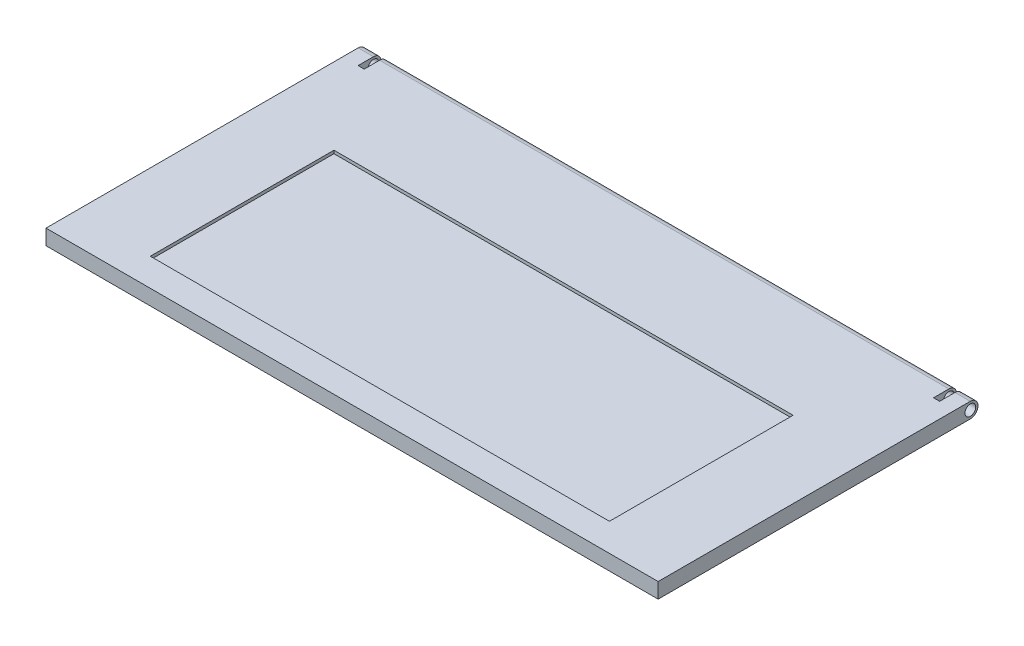
ISO-10303-21;
HEADER;
FILE_DESCRIPTION(('STEP AP214'),'2;1');
FILE_NAME('part.step','',(''),(''),'','','');
FILE_SCHEMA(('AUTOMOTIVE_DESIGN { 1 0 10303 214 1 1 1 1 }'));
ENDSEC;
DATA;
#1=APPLICATION_CONTEXT('core data for automotive mechanical design processes');
#2=APPLICATION_PROTOCOL_DEFINITION('international standard','automotive_design',2000,#1);
#3=PRODUCT_CONTEXT('',#1,'mechanical');
#4=PRODUCT('Part','Part','',(#3));
#5=PRODUCT_RELATED_PRODUCT_CATEGORY('part','',(#4));
#6=PRODUCT_DEFINITION_FORMATION('','',#4);
#7=PRODUCT_DEFINITION_CONTEXT('part definition',#1,'design');
#8=PRODUCT_DEFINITION('design','',#6,#7);
#9=PRODUCT_DEFINITION_SHAPE('','',#8);
#10=(LENGTH_UNIT() NAMED_UNIT(*) SI_UNIT(.MILLI.,.METRE.));
#11=(NAMED_UNIT(*) PLANE_ANGLE_UNIT() SI_UNIT($,.RADIAN.));
#12=(NAMED_UNIT(*) SI_UNIT($,.STERADIAN.) SOLID_ANGLE_UNIT());
#13=UNCERTAINTY_MEASURE_WITH_UNIT(LENGTH_MEASURE(1.E-05),#10,'distance_accuracy_value','');
#14=(GEOMETRIC_REPRESENTATION_CONTEXT(3) GLOBAL_UNCERTAINTY_ASSIGNED_CONTEXT((#13)) GLOBAL_UNIT_ASSIGNED_CONTEXT((#10,
#11,#12)) REPRESENTATION_CONTEXT('',''));
#15=CARTESIAN_POINT('',(0.,0.,0.));
#16=DIRECTION('',(0.,0.,1.));
#17=DIRECTION('',(1.,0.,0.));
#18=AXIS2_PLACEMENT_3D('',#15,#16,#17);
#19=CARTESIAN_POINT('',(-93.,5.,47.5));
#20=DIRECTION('',(1.,0.,0.));
#21=DIRECTION('',(0.,0.,-1.));
#22=AXIS2_PLACEMENT_3D('',#19,#20,#21);
#23=PLANE('',#22);
#24=CARTESIAN_POINT('',(-93.,2.5,-54.5));
#25=DIRECTION('',(-1.,0.,0.));
#26=DIRECTION('',(0.,0.,1.));
#27=AXIS2_PLACEMENT_3D('',#24,#25,#26);
#28=CIRCLE('',#27,1.75);
#29=CARTESIAN_POINT('',(-93.,2.5,-52.75));
#30=VERTEX_POINT('',#29);
#31=EDGE_CURVE('E262',#30,#30,#28,.T.);
#32=ORIENTED_EDGE('',*,*,#31,.F.);
#33=EDGE_LOOP('',(#32));
#34=FACE_BOUND('',#33,.T.);
#35=DIRECTION('',(0.,-1.,0.));
#36=VECTOR('',#35,1.);
#37=CARTESIAN_POINT('',(-93.,5.,-49.4697976722573));
#38=LINE('',#37,#36);
#39=CARTESIAN_POINT('',(-93.,5.,-49.4697976722573));
#40=VERTEX_POINT('',#39);
#41=CARTESIAN_POINT('',(-93.,0.,-49.4697976722573));
#42=VERTEX_POINT('',#41);
#43=EDGE_CURVE('E58',#40,#42,#38,.T.);
#44=ORIENTED_EDGE('',*,*,#43,.F.);
#45=DIRECTION('',(0.,0.,1.));
#46=VECTOR('',#45,1.);
#47=CARTESIAN_POINT('',(-93.,5.,47.5));
#48=LINE('',#47,#46);
#49=CARTESIAN_POINT('',(-93.,5.,-54.5));
#50=VERTEX_POINT('',#49);
#51=EDGE_CURVE('E252',#50,#40,#48,.T.);
#52=ORIENTED_EDGE('',*,*,#51,.F.);
#53=CARTESIAN_POINT('',(-93.,2.5,-54.5));
#54=DIRECTION('',(-1.,0.,0.));
#55=DIRECTION('',(0.,0.,-1.));
#56=AXIS2_PLACEMENT_3D('',#53,#54,#55);
#57=CIRCLE('',#56,2.5);
#58=CARTESIAN_POINT('',(-93.,0.,-54.5));
#59=VERTEX_POINT('',#58);
#60=EDGE_CURVE('E261',#50,#59,#57,.T.);
#61=ORIENTED_EDGE('',*,*,#60,.T.);
#62=DIRECTION('',(0.,0.,1.));
#63=VECTOR('',#62,1.);
#64=CARTESIAN_POINT('',(-93.,0.,47.5));
#65=LINE('',#64,#63);
#66=EDGE_CURVE('E302',#59,#42,#65,.T.);
#67=ORIENTED_EDGE('',*,*,#66,.T.);
#68=EDGE_LOOP('',(#44,#52,#61,#67));
#69=FACE_BOUND('',#68,.T.);
#70=ADVANCED_FACE('F33',(#34,#69),#23,.F.);
#71=CARTESIAN_POINT('',(93.,5.,47.5));
#72=DIRECTION('',(0.,0.,-1.));
#73=DIRECTION('',(-1.,0.,0.));
#74=AXIS2_PLACEMENT_3D('',#71,#72,#73);
#75=PLANE('',#74);
#76=DIRECTION('',(1.,0.,0.));
#77=VECTOR('',#76,1.);
#78=CARTESIAN_POINT('',(93.,0.,47.5));
#79=LINE('',#78,#77);
#80=CARTESIAN_POINT('',(-100.,0.,47.5));
#81=VERTEX_POINT('',#80);
#82=CARTESIAN_POINT('',(100.,0.,47.5));
#83=VERTEX_POINT('',#82);
#84=EDGE_CURVE('E314',#81,#83,#79,.T.);
#85=ORIENTED_EDGE('',*,*,#84,.T.);
#86=DIRECTION('',(0.,1.,0.));
#87=VECTOR('',#86,1.);
#88=CARTESIAN_POINT('',(100.,0.,47.5));
#89=LINE('',#88,#87);
#90=CARTESIAN_POINT('',(100.,5.,47.5));
#91=VERTEX_POINT('',#90);
#92=EDGE_CURVE('E175',#83,#91,#89,.T.);
#93=ORIENTED_EDGE('',*,*,#92,.T.);
#94=DIRECTION('',(1.,0.,0.));
#95=VECTOR('',#94,1.);
#96=CARTESIAN_POINT('',(93.,5.,47.5));
#97=LINE('',#96,#95);
#98=CARTESIAN_POINT('',(-100.,5.,47.5));
#99=VERTEX_POINT('',#98);
#100=EDGE_CURVE('E42',#99,#91,#97,.T.);
#101=ORIENTED_EDGE('',*,*,#100,.F.);
#102=DIRECTION('',(0.,1.,0.));
#103=VECTOR('',#102,1.);
#104=CARTESIAN_POINT('',(-100.,0.,47.5));
#105=LINE('',#104,#103);
#106=EDGE_CURVE('E204',#81,#99,#105,.T.);
#107=ORIENTED_EDGE('',*,*,#106,.F.);
#108=EDGE_LOOP('',(#85,#93,#101,#107));
#109=FACE_BOUND('',#108,.T.);
#110=ADVANCED_FACE('F346',(#109),#75,.F.);
#111=CARTESIAN_POINT('',(93.,5.,47.5));
#112=DIRECTION('',(-1.,0.,0.));
#113=DIRECTION('',(0.,0.,1.));
#114=AXIS2_PLACEMENT_3D('',#111,#112,#113);
#115=PLANE('',#114);
#116=DIRECTION('',(0.,0.,-1.));
#117=VECTOR('',#116,1.);
#118=CARTESIAN_POINT('',(93.,5.,47.5));
#119=LINE('',#118,#117);
#120=CARTESIAN_POINT('',(93.,5.,-49.4697976722574));
#121=VERTEX_POINT('',#120);
#122=CARTESIAN_POINT('',(93.,5.,-54.5));
#123=VERTEX_POINT('',#122);
#124=EDGE_CURVE('E11',#121,#123,#119,.T.);
#125=ORIENTED_EDGE('',*,*,#124,.F.);
#126=DIRECTION('',(0.,-1.,0.));
#127=VECTOR('',#126,1.);
#128=CARTESIAN_POINT('',(93.,5.,-49.4697976722574));
#129=LINE('',#128,#127);
#130=CARTESIAN_POINT('',(93.,0.,-49.4697976722574));
#131=VERTEX_POINT('',#130);
#132=EDGE_CURVE('E228',#121,#131,#129,.T.);
#133=ORIENTED_EDGE('',*,*,#132,.T.);
#134=DIRECTION('',(0.,0.,-1.));
#135=VECTOR('',#134,1.);
#136=CARTESIAN_POINT('',(93.,0.,47.5));
#137=LINE('',#136,#135);
#138=CARTESIAN_POINT('',(93.,0.,-54.5));
#139=VERTEX_POINT('',#138);
#140=EDGE_CURVE('E317',#131,#139,#137,.T.);
#141=ORIENTED_EDGE('',*,*,#140,.T.);
#142=CARTESIAN_POINT('',(93.,2.5,-54.5));
#143=DIRECTION('',(-1.,0.,0.));
#144=DIRECTION('',(0.,0.,-1.));
#145=AXIS2_PLACEMENT_3D('',#142,#143,#144);
#146=CIRCLE('',#145,2.5);
#147=EDGE_CURVE('E265',#123,#139,#146,.T.);
#148=ORIENTED_EDGE('',*,*,#147,.F.);
#149=EDGE_LOOP('',(#125,#133,#141,#148));
#150=FACE_BOUND('',#149,.T.);
#151=CARTESIAN_POINT('',(93.,2.5,-54.5));
#152=DIRECTION('',(-1.,0.,0.));
#153=DIRECTION('',(0.,0.,1.));
#154=AXIS2_PLACEMENT_3D('',#151,#152,#153);
#155=CIRCLE('',#154,1.75);
#156=CARTESIAN_POINT('',(93.,2.5,-52.75));
#157=VERTEX_POINT('',#156);
#158=EDGE_CURVE('E258',#157,#157,#155,.T.);
#159=ORIENTED_EDGE('',*,*,#158,.T.);
#160=EDGE_LOOP('',(#159));
#161=FACE_BOUND('',#160,.T.);
#162=ADVANCED_FACE('F355',(#150,#161),#115,.F.);
#163=CARTESIAN_POINT('',(0.,5.,0.));
#164=DIRECTION('',(0.,1.,0.));
#165=DIRECTION('',(0.,0.,1.));
#166=AXIS2_PLACEMENT_3D('',#163,#164,#165);
#167=PLANE('',#166);
#168=DIRECTION('',(0.,0.,1.));
#169=VECTOR('',#168,1.);
#170=CARTESIAN_POINT('',(-75.,5.,38.4183408832541));
#171=LINE('',#170,#169);
#172=CARTESIAN_POINT('',(-75.,5.,-21.5816591167459));
#173=VERTEX_POINT('',#172);
#174=CARTESIAN_POINT('',(-75.,5.,38.4183408832541));
#175=VERTEX_POINT('',#174);
#176=EDGE_CURVE('E274',#173,#175,#171,.T.);
#177=ORIENTED_EDGE('',*,*,#176,.F.);
#178=DIRECTION('',(-1.,0.,0.));
#179=VECTOR('',#178,1.);
#180=CARTESIAN_POINT('',(75.,5.,-21.5816591167459));
#181=LINE('',#180,#179);
#182=CARTESIAN_POINT('',(75.,5.,-21.5816591167459));
#183=VERTEX_POINT('',#182);
#184=EDGE_CURVE('E281',#183,#173,#181,.T.);
#185=ORIENTED_EDGE('',*,*,#184,.F.);
#186=DIRECTION('',(0.,0.,-1.));
#187=VECTOR('',#186,1.);
#188=CARTESIAN_POINT('',(75.,5.,38.4183408832541));
#189=LINE('',#188,#187);
#190=CARTESIAN_POINT('',(75.,5.,38.4183408832541));
#191=VERTEX_POINT('',#190);
#192=EDGE_CURVE('E295',#191,#183,#189,.T.);
#193=ORIENTED_EDGE('',*,*,#192,.F.);
#194=DIRECTION('',(1.,0.,0.));
#195=VECTOR('',#194,1.);
#196=CARTESIAN_POINT('',(75.,5.,38.4183408832541));
#197=LINE('',#196,#195);
#198=EDGE_CURVE('E292',#175,#191,#197,.T.);
#199=ORIENTED_EDGE('',*,*,#198,.F.);
#200=EDGE_LOOP('',(#177,#185,#193,#199));
#201=FACE_BOUND('',#200,.T.);
#202=ORIENTED_EDGE('',*,*,#51,.T.);
#203=DIRECTION('',(1.,0.,0.));
#204=VECTOR('',#203,1.);
#205=CARTESIAN_POINT('',(-95.,5.,-49.4697976722573));
#206=LINE('',#205,#204);
#207=CARTESIAN_POINT('',(-95.,5.,-49.4697976722573));
#208=VERTEX_POINT('',#207);
#209=EDGE_CURVE('E246',#208,#40,#206,.T.);
#210=ORIENTED_EDGE('',*,*,#209,.F.);
#211=DIRECTION('',(0.,0.,-1.));
#212=VECTOR('',#211,1.);
#213=CARTESIAN_POINT('',(-95.,5.,-54.5));
#214=LINE('',#213,#212);
#215=CARTESIAN_POINT('',(-95.,5.,-54.5));
#216=VERTEX_POINT('',#215);
#217=EDGE_CURVE('E201',#208,#216,#214,.T.);
#218=ORIENTED_EDGE('',*,*,#217,.T.);
#219=DIRECTION('',(1.,0.,0.));
#220=VECTOR('',#219,1.);
#221=CARTESIAN_POINT('',(-100.,5.,-54.5));
#222=LINE('',#221,#220);
#223=CARTESIAN_POINT('',(-100.,5.,-54.5));
#224=VERTEX_POINT('',#223);
#225=EDGE_CURVE('E209',#224,#216,#222,.T.);
#226=ORIENTED_EDGE('',*,*,#225,.F.);
#227=DIRECTION('',(0.,0.,-1.));
#228=VECTOR('',#227,1.);
#229=CARTESIAN_POINT('',(-100.,5.,-54.5));
#230=LINE('',#229,#228);
#231=EDGE_CURVE('E207',#99,#224,#230,.T.);
#232=ORIENTED_EDGE('',*,*,#231,.F.);
#233=ORIENTED_EDGE('',*,*,#100,.T.);
#234=DIRECTION('',(0.,0.,-1.));
#235=VECTOR('',#234,1.);
#236=CARTESIAN_POINT('',(100.,5.,-54.5));
#237=LINE('',#236,#235);
#238=CARTESIAN_POINT('',(100.,5.,-54.5));
#239=VERTEX_POINT('',#238);
#240=EDGE_CURVE('E167',#91,#239,#237,.T.);
#241=ORIENTED_EDGE('',*,*,#240,.T.);
#242=DIRECTION('',(-1.,0.,0.));
#243=VECTOR('',#242,1.);
#244=CARTESIAN_POINT('',(100.,5.,-54.5));
#245=LINE('',#244,#243);
#246=CARTESIAN_POINT('',(95.,5.,-54.5));
#247=VERTEX_POINT('',#246);
#248=EDGE_CURVE('E150',#239,#247,#245,.T.);
#249=ORIENTED_EDGE('',*,*,#248,.T.);
#250=DIRECTION('',(0.,0.,-1.));
#251=VECTOR('',#250,1.);
#252=CARTESIAN_POINT('',(95.,5.,-54.5));
#253=LINE('',#252,#251);
#254=CARTESIAN_POINT('',(95.,5.,-49.4697976722574));
#255=VERTEX_POINT('',#254);
#256=EDGE_CURVE('E182',#255,#247,#253,.T.);
#257=ORIENTED_EDGE('',*,*,#256,.F.);
#258=DIRECTION('',(-1.,0.,0.));
#259=VECTOR('',#258,1.);
#260=CARTESIAN_POINT('',(95.,5.,-49.4697976722574));
#261=LINE('',#260,#259);
#262=EDGE_CURVE('E234',#255,#121,#261,.T.);
#263=ORIENTED_EDGE('',*,*,#262,.T.);
#264=ORIENTED_EDGE('',*,*,#124,.T.);
#265=DIRECTION('',(-1.,0.,0.));
#266=VECTOR('',#265,1.);
#267=CARTESIAN_POINT('',(93.,5.,-54.5));
#268=LINE('',#267,#266);
#269=EDGE_CURVE('E268',#123,#50,#268,.T.);
#270=ORIENTED_EDGE('',*,*,#269,.T.);
#271=EDGE_LOOP('',(#202,#210,#218,#226,#232,#233,#241,#249,#257,#263,#264,#270));
#272=FACE_BOUND('',#271,.T.);
#273=ADVANCED_FACE('F173',(#201,#272),#167,.T.);
#274=CARTESIAN_POINT('',(0.,0.,0.));
#275=DIRECTION('',(0.,1.,0.));
#276=DIRECTION('',(0.,0.,1.));
#277=AXIS2_PLACEMENT_3D('',#274,#275,#276);
#278=PLANE('',#277);
#279=ORIENTED_EDGE('',*,*,#66,.F.);
#280=DIRECTION('',(-1.,0.,0.));
#281=VECTOR('',#280,1.);
#282=CARTESIAN_POINT('',(93.,0.,-54.5));
#283=LINE('',#282,#281);
#284=EDGE_CURVE('E271',#139,#59,#283,.T.);
#285=ORIENTED_EDGE('',*,*,#284,.F.);
#286=ORIENTED_EDGE('',*,*,#140,.F.);
#287=DIRECTION('',(-1.,0.,0.));
#288=VECTOR('',#287,1.);
#289=CARTESIAN_POINT('',(95.,0.,-49.4697976722574));
#290=LINE('',#289,#288);
#291=CARTESIAN_POINT('',(95.,0.,-49.4697976722574));
#292=VERTEX_POINT('',#291);
#293=EDGE_CURVE('E50',#292,#131,#290,.T.);
#294=ORIENTED_EDGE('',*,*,#293,.F.);
#295=DIRECTION('',(0.,0.,1.));
#296=VECTOR('',#295,1.);
#297=CARTESIAN_POINT('',(95.,0.,47.5));
#298=LINE('',#297,#296);
#299=CARTESIAN_POINT('',(95.,0.,-54.5));
#300=VERTEX_POINT('',#299);
#301=EDGE_CURVE('E171',#300,#292,#298,.T.);
#302=ORIENTED_EDGE('',*,*,#301,.F.);
#303=DIRECTION('',(-1.,0.,0.));
#304=VECTOR('',#303,1.);
#305=CARTESIAN_POINT('',(100.,0.,-54.5));
#306=LINE('',#305,#304);
#307=CARTESIAN_POINT('',(100.,0.,-54.5));
#308=VERTEX_POINT('',#307);
#309=EDGE_CURVE('E161',#308,#300,#306,.T.);
#310=ORIENTED_EDGE('',*,*,#309,.F.);
#311=DIRECTION('',(0.,0.,1.));
#312=VECTOR('',#311,1.);
#313=CARTESIAN_POINT('',(100.,0.,47.5));
#314=LINE('',#313,#312);
#315=EDGE_CURVE('E170',#308,#83,#314,.T.);
#316=ORIENTED_EDGE('',*,*,#315,.T.);
#317=ORIENTED_EDGE('',*,*,#84,.F.);
#318=DIRECTION('',(0.,0.,1.));
#319=VECTOR('',#318,1.);
#320=CARTESIAN_POINT('',(-100.,0.,47.5));
#321=LINE('',#320,#319);
#322=CARTESIAN_POINT('',(-100.,0.,-54.5));
#323=VERTEX_POINT('',#322);
#324=EDGE_CURVE('E200',#323,#81,#321,.T.);
#325=ORIENTED_EDGE('',*,*,#324,.F.);
#326=DIRECTION('',(1.,0.,0.));
#327=VECTOR('',#326,1.);
#328=CARTESIAN_POINT('',(-100.,0.,-54.5));
#329=LINE('',#328,#327);
#330=CARTESIAN_POINT('',(-95.,0.,-54.5));
#331=VERTEX_POINT('',#330);
#332=EDGE_CURVE('E230',#323,#331,#329,.T.);
#333=ORIENTED_EDGE('',*,*,#332,.T.);
#334=DIRECTION('',(0.,0.,1.));
#335=VECTOR('',#334,1.);
#336=CARTESIAN_POINT('',(-95.,0.,47.5));
#337=LINE('',#336,#335);
#338=CARTESIAN_POINT('',(-95.,0.,-49.4697976722573));
#339=VERTEX_POINT('',#338);
#340=EDGE_CURVE('E212',#331,#339,#337,.T.);
#341=ORIENTED_EDGE('',*,*,#340,.T.);
#342=DIRECTION('',(1.,0.,0.));
#343=VECTOR('',#342,1.);
#344=CARTESIAN_POINT('',(-95.,0.,-49.4697976722573));
#345=LINE('',#344,#343);
#346=EDGE_CURVE('E241',#339,#42,#345,.T.);
#347=ORIENTED_EDGE('',*,*,#346,.T.);
#348=EDGE_LOOP('',(#279,#285,#286,#294,#302,#310,#316,#317,#325,#333,#341,#347));
#349=FACE_BOUND('',#348,.T.);
#350=ADVANCED_FACE('F333',(#349),#278,.F.);
#351=CARTESIAN_POINT('',(-75.,4.,38.4183408832541));
#352=DIRECTION('',(-1.,0.,0.));
#353=DIRECTION('',(0.,0.,1.));
#354=AXIS2_PLACEMENT_3D('',#351,#352,#353);
#355=PLANE('',#354);
#356=ORIENTED_EDGE('',*,*,#176,.T.);
#357=DIRECTION('',(0.,1.,0.));
#358=VECTOR('',#357,1.);
#359=CARTESIAN_POINT('',(-75.,4.,38.4183408832541));
#360=LINE('',#359,#358);
#361=CARTESIAN_POINT('',(-75.,4.,38.4183408832541));
#362=VERTEX_POINT('',#361);
#363=EDGE_CURVE('E290',#362,#175,#360,.T.);
#364=ORIENTED_EDGE('',*,*,#363,.F.);
#365=DIRECTION('',(0.,0.,1.));
#366=VECTOR('',#365,1.);
#367=CARTESIAN_POINT('',(-75.,4.,38.4183408832541));
#368=LINE('',#367,#366);
#369=CARTESIAN_POINT('',(-75.,4.,-21.5816591167459));
#370=VERTEX_POINT('',#369);
#371=EDGE_CURVE('E277',#370,#362,#368,.T.);
#372=ORIENTED_EDGE('',*,*,#371,.F.);
#373=DIRECTION('',(0.,1.,0.));
#374=VECTOR('',#373,1.);
#375=CARTESIAN_POINT('',(-75.,4.,-21.5816591167459));
#376=LINE('',#375,#374);
#377=EDGE_CURVE('E300',#370,#173,#376,.T.);
#378=ORIENTED_EDGE('',*,*,#377,.T.);
#379=EDGE_LOOP('',(#356,#364,#372,#378));
#380=FACE_BOUND('',#379,.T.);
#381=ADVANCED_FACE('F376',(#380),#355,.F.);
#382=CARTESIAN_POINT('',(75.,4.,-21.5816591167459));
#383=DIRECTION('',(0.,0.,-1.));
#384=DIRECTION('',(-1.,0.,0.));
#385=AXIS2_PLACEMENT_3D('',#382,#383,#384);
#386=PLANE('',#385);
#387=ORIENTED_EDGE('',*,*,#184,.T.);
#388=ORIENTED_EDGE('',*,*,#377,.F.);
#389=DIRECTION('',(-1.,0.,0.));
#390=VECTOR('',#389,1.);
#391=CARTESIAN_POINT('',(75.,4.,-21.5816591167459));
#392=LINE('',#391,#390);
#393=CARTESIAN_POINT('',(75.,4.,-21.5816591167459));
#394=VERTEX_POINT('',#393);
#395=EDGE_CURVE('E287',#394,#370,#392,.T.);
#396=ORIENTED_EDGE('',*,*,#395,.F.);
#397=DIRECTION('',(0.,1.,0.));
#398=VECTOR('',#397,1.);
#399=CARTESIAN_POINT('',(75.,4.,-21.5816591167459));
#400=LINE('',#399,#398);
#401=EDGE_CURVE('E303',#394,#183,#400,.T.);
#402=ORIENTED_EDGE('',*,*,#401,.T.);
#403=EDGE_LOOP('',(#387,#388,#396,#402));
#404=FACE_BOUND('',#403,.T.);
#405=ADVANCED_FACE('F382',(#404),#386,.F.);
#406=CARTESIAN_POINT('',(75.,4.,38.4183408832541));
#407=DIRECTION('',(1.,0.,0.));
#408=DIRECTION('',(0.,0.,-1.));
#409=AXIS2_PLACEMENT_3D('',#406,#407,#408);
#410=PLANE('',#409);
#411=ORIENTED_EDGE('',*,*,#192,.T.);
#412=ORIENTED_EDGE('',*,*,#401,.F.);
#413=DIRECTION('',(0.,0.,-1.));
#414=VECTOR('',#413,1.);
#415=CARTESIAN_POINT('',(75.,4.,38.4183408832541));
#416=LINE('',#415,#414);
#417=CARTESIAN_POINT('',(75.,4.,38.4183408832541));
#418=VERTEX_POINT('',#417);
#419=EDGE_CURVE('E284',#418,#394,#416,.T.);
#420=ORIENTED_EDGE('',*,*,#419,.F.);
#421=DIRECTION('',(0.,1.,0.));
#422=VECTOR('',#421,1.);
#423=CARTESIAN_POINT('',(75.,4.,38.4183408832541));
#424=LINE('',#423,#422);
#425=EDGE_CURVE('E305',#418,#191,#424,.T.);
#426=ORIENTED_EDGE('',*,*,#425,.T.);
#427=EDGE_LOOP('',(#411,#412,#420,#426));
#428=FACE_BOUND('',#427,.T.);
#429=ADVANCED_FACE('F388',(#428),#410,.F.);
#430=CARTESIAN_POINT('',(75.,4.,38.4183408832541));
#431=DIRECTION('',(0.,0.,1.));
#432=DIRECTION('',(1.,0.,0.));
#433=AXIS2_PLACEMENT_3D('',#430,#431,#432);
#434=PLANE('',#433);
#435=ORIENTED_EDGE('',*,*,#198,.T.);
#436=ORIENTED_EDGE('',*,*,#425,.F.);
#437=DIRECTION('',(1.,0.,0.));
#438=VECTOR('',#437,1.);
#439=CARTESIAN_POINT('',(75.,4.,38.4183408832541));
#440=LINE('',#439,#438);
#441=EDGE_CURVE('E280',#362,#418,#440,.T.);
#442=ORIENTED_EDGE('',*,*,#441,.F.);
#443=ORIENTED_EDGE('',*,*,#363,.T.);
#444=EDGE_LOOP('',(#435,#436,#442,#443));
#445=FACE_BOUND('',#444,.T.);
#446=ADVANCED_FACE('F384',(#445),#434,.F.);
#447=CARTESIAN_POINT('',(0.,4.,0.));
#448=DIRECTION('',(0.,1.,0.));
#449=DIRECTION('',(0.,0.,1.));
#450=AXIS2_PLACEMENT_3D('',#447,#448,#449);
#451=PLANE('',#450);
#452=ORIENTED_EDGE('',*,*,#371,.T.);
#453=ORIENTED_EDGE('',*,*,#441,.T.);
#454=ORIENTED_EDGE('',*,*,#419,.T.);
#455=ORIENTED_EDGE('',*,*,#395,.T.);
#456=EDGE_LOOP('',(#452,#453,#454,#455));
#457=FACE_BOUND('',#456,.T.);
#458=ADVANCED_FACE('F387',(#457),#451,.T.);
#459=CARTESIAN_POINT('',(93.,2.5,-54.5));
#460=DIRECTION('',(-1.,0.,0.));
#461=DIRECTION('',(0.,0.,1.));
#462=AXIS2_PLACEMENT_3D('',#459,#460,#461);
#463=CYLINDRICAL_SURFACE('',#462,2.5);
#464=ORIENTED_EDGE('',*,*,#60,.F.);
#465=ORIENTED_EDGE('',*,*,#269,.F.);
#466=ORIENTED_EDGE('',*,*,#147,.T.);
#467=ORIENTED_EDGE('',*,*,#284,.T.);
#468=EDGE_LOOP('',(#464,#465,#466,#467));
#469=FACE_BOUND('',#468,.T.);
#470=ADVANCED_FACE('F328',(#469),#463,.T.);
#471=CARTESIAN_POINT('',(93.,2.5,-54.5));
#472=DIRECTION('',(-1.,0.,0.));
#473=DIRECTION('',(0.,0.,1.));
#474=AXIS2_PLACEMENT_3D('',#471,#472,#473);
#475=CYLINDRICAL_SURFACE('',#474,1.75);
#476=CARTESIAN_POINT('',(93.,2.5,-52.75));
#477=CARTESIAN_POINT('',(91.0625,2.5,-52.75));
#478=CARTESIAN_POINT('',(89.125,2.5,-52.75));
#479=CARTESIAN_POINT('',(85.25,2.5,-52.75));
#480=CARTESIAN_POINT('',(83.3125,2.5,-52.75));
#481=CARTESIAN_POINT('',(79.4375,2.5,-52.75));
#482=CARTESIAN_POINT('',(77.5,2.5,-52.75));
#483=CARTESIAN_POINT('',(73.625,2.5,-52.75));
#484=CARTESIAN_POINT('',(71.6875,2.5,-52.75));
#485=CARTESIAN_POINT('',(67.8125,2.5,-52.75));
#486=CARTESIAN_POINT('',(65.875,2.5,-52.75));
#487=CARTESIAN_POINT('',(62.,2.5,-52.75));
#488=CARTESIAN_POINT('',(60.0625,2.5,-52.75));
#489=CARTESIAN_POINT('',(56.1875,2.5,-52.75));
#490=CARTESIAN_POINT('',(54.25,2.5,-52.75));
#491=CARTESIAN_POINT('',(50.375,2.5,-52.75));
#492=CARTESIAN_POINT('',(48.4375,2.5,-52.75));
#493=CARTESIAN_POINT('',(44.5625,2.5,-52.75));
#494=CARTESIAN_POINT('',(42.625,2.5,-52.75));
#495=CARTESIAN_POINT('',(38.75,2.5,-52.75));
#496=CARTESIAN_POINT('',(36.8125,2.5,-52.75));
#497=CARTESIAN_POINT('',(32.9375,2.5,-52.75));
#498=CARTESIAN_POINT('',(31.,2.5,-52.75));
#499=CARTESIAN_POINT('',(27.125,2.5,-52.75));
#500=CARTESIAN_POINT('',(25.1875,2.5,-52.75));
#501=CARTESIAN_POINT('',(21.3125,2.5,-52.75));
#502=CARTESIAN_POINT('',(19.375,2.5,-52.75));
#503=CARTESIAN_POINT('',(15.5,2.5,-52.75));
#504=CARTESIAN_POINT('',(13.5625,2.5,-52.75));
#505=CARTESIAN_POINT('',(9.68750000000001,2.5,-52.75));
#506=CARTESIAN_POINT('',(7.75000000000001,2.5,-52.75));
#507=CARTESIAN_POINT('',(3.87500000000001,2.5,-52.75));
#508=CARTESIAN_POINT('',(1.93750000000001,2.5,-52.75));
#509=CARTESIAN_POINT('',(-1.93749999999999,2.5,-52.75));
#510=CARTESIAN_POINT('',(-3.87499999999999,2.5,-52.75));
#511=CARTESIAN_POINT('',(-7.74999999999998,2.5,-52.75));
#512=CARTESIAN_POINT('',(-9.68749999999998,2.5,-52.75));
#513=CARTESIAN_POINT('',(-13.5625,2.5,-52.75));
#514=CARTESIAN_POINT('',(-15.5,2.5,-52.75));
#515=CARTESIAN_POINT('',(-19.375,2.5,-52.75));
#516=CARTESIAN_POINT('',(-21.3125,2.5,-52.75));
#517=CARTESIAN_POINT('',(-25.1875,2.5,-52.75));
#518=CARTESIAN_POINT('',(-27.125,2.5,-52.75));
#519=CARTESIAN_POINT('',(-31.,2.5,-52.75));
#520=CARTESIAN_POINT('',(-32.9375,2.5,-52.75));
#521=CARTESIAN_POINT('',(-36.8125,2.5,-52.75));
#522=CARTESIAN_POINT('',(-38.75,2.5,-52.75));
#523=CARTESIAN_POINT('',(-42.625,2.5,-52.75));
#524=CARTESIAN_POINT('',(-44.5625,2.5,-52.75));
#525=CARTESIAN_POINT('',(-48.4375,2.5,-52.75));
#526=CARTESIAN_POINT('',(-50.375,2.5,-52.75));
#527=CARTESIAN_POINT('',(-54.25,2.5,-52.75));
#528=CARTESIAN_POINT('',(-56.1875,2.5,-52.75));
#529=CARTESIAN_POINT('',(-60.0625,2.5,-52.75));
#530=CARTESIAN_POINT('',(-62.,2.5,-52.75));
#531=CARTESIAN_POINT('',(-65.875,2.5,-52.75));
#532=CARTESIAN_POINT('',(-67.8125,2.5,-52.75));
#533=CARTESIAN_POINT('',(-71.6875,2.5,-52.75));
#534=CARTESIAN_POINT('',(-73.625,2.5,-52.75));
#535=CARTESIAN_POINT('',(-77.5,2.5,-52.75));
#536=CARTESIAN_POINT('',(-79.4375,2.5,-52.75));
#537=CARTESIAN_POINT('',(-83.3125,2.5,-52.75));
#538=CARTESIAN_POINT('',(-85.25,2.5,-52.75));
#539=CARTESIAN_POINT('',(-89.125,2.5,-52.75));
#540=CARTESIAN_POINT('',(-91.0625,2.5,-52.75));
#541=CARTESIAN_POINT('',(-93.,2.5,-52.75));
#542=B_SPLINE_CURVE_WITH_KNOTS('',3,(#476,#477,#478,#479,#480,#481,#482,#483,#484,#485,#486,
#487,#488,#489,#490,#491,#492,#493,#494,#495,#496,#497,#498,#499,#500,#501,#502,#503,#504,#505,
#506,#507,#508,#509,#510,#511,#512,#513,#514,#515,#516,#517,#518,#519,#520,#521,#522,#523,#524,
#525,#526,#527,#528,#529,#530,#531,#532,#533,#534,#535,#536,#537,#538,#539,#540,#541),
.UNSPECIFIED.,.F.,.F.,(4,2,2,2,2,2,2,2,2,2,2,2,2,2,2,2,2,2,2,2,2,2,2,2,2,2,2,2,2,2,2,2,4),(0.,
5.8125,11.625,17.4375,23.25,29.0625,34.875,40.6875,46.5,52.3125,58.125,63.9375,69.75,75.5625,
81.375,87.1875,93.,98.8125,104.625,110.4375,116.25,122.0625,127.875,133.6875,139.5,145.3125,
151.125,156.9375,162.75,168.5625,174.375,180.1875,186.),.UNSPECIFIED.);
#543=EDGE_CURVE('BSEAM361',#157,#30,#542,.T.);
#544=ORIENTED_EDGE('',*,*,#158,.F.);
#545=ORIENTED_EDGE('',*,*,#31,.T.);
#546=ORIENTED_EDGE('',*,*,#543,.T.);
#547=ORIENTED_EDGE('',*,*,#543,.F.);
#548=EDGE_LOOP('',(#544,#546,#545,#547));
#549=FACE_BOUND('',#548,.T.);
#550=ADVANCED_FACE('F361',(#549),#475,.F.);
#551=CARTESIAN_POINT('',(-95.,5.,-49.4697976722573));
#552=DIRECTION('',(0.,0.,1.));
#553=DIRECTION('',(1.,0.,0.));
#554=AXIS2_PLACEMENT_3D('',#551,#552,#553);
#555=PLANE('',#554);
#556=ORIENTED_EDGE('',*,*,#43,.T.);
#557=ORIENTED_EDGE('',*,*,#346,.F.);
#558=DIRECTION('',(0.,-1.,0.));
#559=VECTOR('',#558,1.);
#560=CARTESIAN_POINT('',(-95.,5.,-49.4697976722573));
#561=LINE('',#560,#559);
#562=EDGE_CURVE('E239',#208,#339,#561,.T.);
#563=ORIENTED_EDGE('',*,*,#562,.F.);
#564=ORIENTED_EDGE('',*,*,#209,.T.);
#565=EDGE_LOOP('',(#556,#557,#563,#564));
#566=FACE_BOUND('',#565,.T.);
#567=ADVANCED_FACE('F322',(#566),#555,.F.);
#568=CARTESIAN_POINT('',(95.,5.,-49.4697976722574));
#569=DIRECTION('',(0.,0.,-1.));
#570=DIRECTION('',(-1.,0.,0.));
#571=AXIS2_PLACEMENT_3D('',#568,#569,#570);
#572=PLANE('',#571);
#573=ORIENTED_EDGE('',*,*,#132,.F.);
#574=ORIENTED_EDGE('',*,*,#262,.F.);
#575=DIRECTION('',(0.,-1.,0.));
#576=VECTOR('',#575,1.);
#577=CARTESIAN_POINT('',(95.,5.,-49.4697976722574));
#578=LINE('',#577,#576);
#579=EDGE_CURVE('E36',#255,#292,#578,.T.);
#580=ORIENTED_EDGE('',*,*,#579,.T.);
#581=ORIENTED_EDGE('',*,*,#293,.T.);
#582=EDGE_LOOP('',(#573,#574,#580,#581));
#583=FACE_BOUND('',#582,.T.);
#584=ADVANCED_FACE('F352',(#583),#572,.T.);
#585=CARTESIAN_POINT('',(-95.,2.5,-54.5));
#586=DIRECTION('',(-1.,0.,0.));
#587=DIRECTION('',(0.,0.,1.));
#588=AXIS2_PLACEMENT_3D('',#585,#586,#587);
#589=PLANE('',#588);
#590=CARTESIAN_POINT('',(-95.,2.5,-54.5));
#591=DIRECTION('',(-1.,0.,0.));
#592=DIRECTION('',(0.,0.,1.));
#593=AXIS2_PLACEMENT_3D('',#590,#591,#592);
#594=CIRCLE('',#593,1.75);
#595=CARTESIAN_POINT('',(-95.,2.5,-52.75));
#596=VERTEX_POINT('',#595);
#597=EDGE_CURVE('E160',#596,#596,#594,.T.);
#598=ORIENTED_EDGE('',*,*,#597,.T.);
#599=EDGE_LOOP('',(#598));
#600=FACE_BOUND('',#599,.T.);
#601=ORIENTED_EDGE('',*,*,#217,.F.);
#602=ORIENTED_EDGE('',*,*,#562,.T.);
#603=ORIENTED_EDGE('',*,*,#340,.F.);
#604=CARTESIAN_POINT('',(-95.,2.5,-54.5));
#605=DIRECTION('',(-1.,0.,0.));
#606=DIRECTION('',(0.,0.,1.));
#607=AXIS2_PLACEMENT_3D('',#604,#605,#606);
#608=CIRCLE('',#607,2.5);
#609=EDGE_CURVE('E194',#216,#331,#608,.T.);
#610=ORIENTED_EDGE('',*,*,#609,.F.);
#611=EDGE_LOOP('',(#601,#602,#603,#610));
#612=FACE_BOUND('',#611,.T.);
#613=ADVANCED_FACE('F337',(#600,#612),#589,.F.);
#614=CARTESIAN_POINT('',(-100.,2.5,-54.5));
#615=DIRECTION('',(-1.,0.,0.));
#616=DIRECTION('',(0.,0.,1.));
#617=AXIS2_PLACEMENT_3D('',#614,#615,#616);
#618=PLANE('',#617);
#619=CARTESIAN_POINT('',(-100.,2.5,-54.5));
#620=DIRECTION('',(-1.,0.,0.));
#621=DIRECTION('',(0.,0.,1.));
#622=AXIS2_PLACEMENT_3D('',#619,#620,#621);
#623=CIRCLE('',#622,2.5);
#624=EDGE_CURVE('E197',#224,#323,#623,.T.);
#625=ORIENTED_EDGE('',*,*,#624,.T.);
#626=ORIENTED_EDGE('',*,*,#324,.T.);
#627=ORIENTED_EDGE('',*,*,#106,.T.);
#628=ORIENTED_EDGE('',*,*,#231,.T.);
#629=EDGE_LOOP('',(#625,#626,#627,#628));
#630=FACE_BOUND('',#629,.T.);
#631=CARTESIAN_POINT('',(-100.,2.5,-54.5));
#632=DIRECTION('',(-1.,0.,0.));
#633=DIRECTION('',(0.,0.,1.));
#634=AXIS2_PLACEMENT_3D('',#631,#632,#633);
#635=CIRCLE('',#634,1.75);
#636=CARTESIAN_POINT('',(-100.,2.5,-52.75));
#637=VERTEX_POINT('',#636);
#638=EDGE_CURVE('E191',#637,#637,#635,.T.);
#639=ORIENTED_EDGE('',*,*,#638,.F.);
#640=EDGE_LOOP('',(#639));
#641=FACE_BOUND('',#640,.T.);
#642=ADVANCED_FACE('F342',(#630,#641),#618,.T.);
#643=CARTESIAN_POINT('',(-100.,2.5,-54.5));
#644=DIRECTION('',(1.,0.,0.));
#645=DIRECTION('',(0.,0.,-1.));
#646=AXIS2_PLACEMENT_3D('',#643,#644,#645);
#647=CYLINDRICAL_SURFACE('',#646,2.5);
#648=ORIENTED_EDGE('',*,*,#609,.T.);
#649=ORIENTED_EDGE('',*,*,#332,.F.);
#650=ORIENTED_EDGE('',*,*,#624,.F.);
#651=ORIENTED_EDGE('',*,*,#225,.T.);
#652=EDGE_LOOP('',(#648,#649,#650,#651));
#653=FACE_BOUND('',#652,.T.);
#654=ADVANCED_FACE('F339',(#653),#647,.T.);
#655=CARTESIAN_POINT('',(-100.,2.5,-54.5));
#656=DIRECTION('',(1.,0.,0.));
#657=DIRECTION('',(0.,0.,-1.));
#658=AXIS2_PLACEMENT_3D('',#655,#656,#657);
#659=CYLINDRICAL_SURFACE('',#658,1.75);
#660=ORIENTED_EDGE('',*,*,#638,.T.);
#661=EDGE_LOOP('',(#660));
#662=FACE_BOUND('',#661,.T.);
#663=ORIENTED_EDGE('',*,*,#597,.F.);
#664=EDGE_LOOP('',(#663));
#665=FACE_BOUND('',#664,.T.);
#666=ADVANCED_FACE('F407',(#662,#665),#659,.F.);
#667=CARTESIAN_POINT('',(100.,2.5,-54.5));
#668=DIRECTION('',(-1.,0.,0.));
#669=DIRECTION('',(0.,0.,1.));
#670=AXIS2_PLACEMENT_3D('',#667,#668,#669);
#671=CYLINDRICAL_SURFACE('',#670,2.5);
#672=CARTESIAN_POINT('',(95.,2.5,-54.5));
#673=DIRECTION('',(-1.,0.,0.));
#674=DIRECTION('',(0.,0.,1.));
#675=AXIS2_PLACEMENT_3D('',#672,#673,#674);
#676=CIRCLE('',#675,2.5);
#677=EDGE_CURVE('E156',#247,#300,#676,.T.);
#678=ORIENTED_EDGE('',*,*,#677,.F.);
#679=ORIENTED_EDGE('',*,*,#248,.F.);
#680=CARTESIAN_POINT('',(100.,2.5,-54.5));
#681=DIRECTION('',(-1.,0.,0.));
#682=DIRECTION('',(0.,0.,1.));
#683=AXIS2_PLACEMENT_3D('',#680,#681,#682);
#684=CIRCLE('',#683,2.5);
#685=EDGE_CURVE('E153',#239,#308,#684,.T.);
#686=ORIENTED_EDGE('',*,*,#685,.T.);
#687=ORIENTED_EDGE('',*,*,#309,.T.);
#688=EDGE_LOOP('',(#678,#679,#686,#687));
#689=FACE_BOUND('',#688,.T.);
#690=ADVANCED_FACE('F152',(#689),#671,.T.);
#691=CARTESIAN_POINT('',(100.,2.5,-54.5));
#692=DIRECTION('',(1.,0.,0.));
#693=DIRECTION('',(0.,0.,1.));
#694=AXIS2_PLACEMENT_3D('',#691,#692,#693);
#695=PLANE('',#694);
#696=CARTESIAN_POINT('',(100.,2.5,-54.5));
#697=DIRECTION('',(-1.,0.,0.));
#698=DIRECTION('',(0.,0.,1.));
#699=AXIS2_PLACEMENT_3D('',#696,#697,#698);
#700=CIRCLE('',#699,1.75);
#701=CARTESIAN_POINT('',(100.,2.5,-52.75));
#702=VERTEX_POINT('',#701);
#703=EDGE_CURVE('E183',#702,#702,#700,.T.);
#704=ORIENTED_EDGE('',*,*,#703,.T.);
#705=EDGE_LOOP('',(#704));
#706=FACE_BOUND('',#705,.T.);
#707=ORIENTED_EDGE('',*,*,#685,.F.);
#708=ORIENTED_EDGE('',*,*,#240,.F.);
#709=ORIENTED_EDGE('',*,*,#92,.F.);
#710=ORIENTED_EDGE('',*,*,#315,.F.);
#711=EDGE_LOOP('',(#707,#708,#709,#710));
#712=FACE_BOUND('',#711,.T.);
#713=ADVANCED_FACE('F165',(#706,#712),#695,.T.);
#714=CARTESIAN_POINT('',(95.,2.5,-54.5));
#715=DIRECTION('',(1.,0.,0.));
#716=DIRECTION('',(0.,0.,1.));
#717=AXIS2_PLACEMENT_3D('',#714,#715,#716);
#718=PLANE('',#717);
#719=ORIENTED_EDGE('',*,*,#579,.F.);
#720=ORIENTED_EDGE('',*,*,#256,.T.);
#721=ORIENTED_EDGE('',*,*,#677,.T.);
#722=ORIENTED_EDGE('',*,*,#301,.T.);
#723=EDGE_LOOP('',(#719,#720,#721,#722));
#724=FACE_BOUND('',#723,.T.);
#725=CARTESIAN_POINT('',(95.,2.5,-54.5));
#726=DIRECTION('',(-1.,0.,0.));
#727=DIRECTION('',(0.,0.,1.));
#728=AXIS2_PLACEMENT_3D('',#725,#726,#727);
#729=CIRCLE('',#728,1.75);
#730=CARTESIAN_POINT('',(95.,2.5,-52.75));
#731=VERTEX_POINT('',#730);
#732=EDGE_CURVE('E433',#731,#731,#729,.T.);
#733=ORIENTED_EDGE('',*,*,#732,.F.);
#734=EDGE_LOOP('',(#733));
#735=FACE_BOUND('',#734,.T.);
#736=ADVANCED_FACE('F349',(#724,#735),#718,.F.);
#737=CARTESIAN_POINT('',(100.,2.5,-54.5));
#738=DIRECTION('',(-1.,0.,0.));
#739=DIRECTION('',(0.,0.,1.));
#740=AXIS2_PLACEMENT_3D('',#737,#738,#739);
#741=CYLINDRICAL_SURFACE('',#740,1.75);
#742=ORIENTED_EDGE('',*,*,#703,.F.);
#743=EDGE_LOOP('',(#742));
#744=FACE_BOUND('',#743,.T.);
#745=ORIENTED_EDGE('',*,*,#732,.T.);
#746=EDGE_LOOP('',(#745));
#747=FACE_BOUND('',#746,.T.);
#748=ADVANCED_FACE('F420',(#744,#747),#741,.F.);
#749=CLOSED_SHELL('',(#70,#110,#162,#273,#350,#381,#405,#429,#446,#458,#470,#550,#567,#584,#613,
#642,#654,#666,#690,#713,#736,#748));
#750=MANIFOLD_SOLID_BREP('B2',#749);
#751=ADVANCED_BREP_SHAPE_REPRESENTATION('',(#18,#750),#14);
#752=SHAPE_DEFINITION_REPRESENTATION(#9,#751);
ENDSEC;
END-ISO-10303-21;
